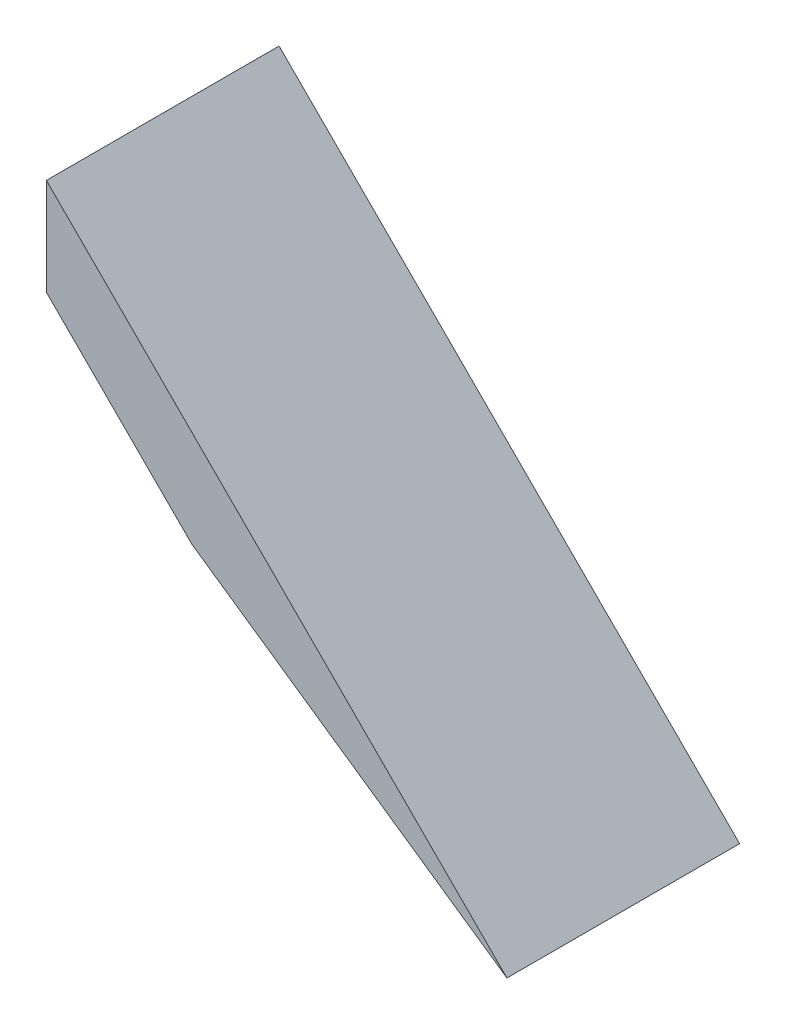
ISO-10303-21;
HEADER;
FILE_DESCRIPTION(('STEP AP214'),'2;1');
FILE_NAME('part.step','',(''),(''),'','','');
FILE_SCHEMA(('AUTOMOTIVE_DESIGN { 1 0 10303 214 1 1 1 1 }'));
ENDSEC;
DATA;
#1=APPLICATION_CONTEXT('core data for automotive mechanical design processes');
#2=APPLICATION_PROTOCOL_DEFINITION('international standard','automotive_design',2000,#1);
#3=PRODUCT_CONTEXT('',#1,'mechanical');
#4=PRODUCT('Part','Part','',(#3));
#5=PRODUCT_RELATED_PRODUCT_CATEGORY('part','',(#4));
#6=PRODUCT_DEFINITION_FORMATION('','',#4);
#7=PRODUCT_DEFINITION_CONTEXT('part definition',#1,'design');
#8=PRODUCT_DEFINITION('design','',#6,#7);
#9=PRODUCT_DEFINITION_SHAPE('','',#8);
#10=(LENGTH_UNIT() NAMED_UNIT(*) SI_UNIT(.MILLI.,.METRE.));
#11=(NAMED_UNIT(*) PLANE_ANGLE_UNIT() SI_UNIT($,.RADIAN.));
#12=(NAMED_UNIT(*) SI_UNIT($,.STERADIAN.) SOLID_ANGLE_UNIT());
#13=UNCERTAINTY_MEASURE_WITH_UNIT(LENGTH_MEASURE(1.E-05),#10,'distance_accuracy_value','');
#14=(GEOMETRIC_REPRESENTATION_CONTEXT(3) GLOBAL_UNCERTAINTY_ASSIGNED_CONTEXT((#13)) GLOBAL_UNIT_ASSIGNED_CONTEXT((#10,
#11,#12)) REPRESENTATION_CONTEXT('',''));
#15=CARTESIAN_POINT('',(0.,0.,0.));
#16=DIRECTION('',(0.,0.,1.));
#17=DIRECTION('',(1.,0.,0.));
#18=AXIS2_PLACEMENT_3D('',#15,#16,#17);
#19=CARTESIAN_POINT('',(-0.2778125,-0.03968750000001,0.));
#20=DIRECTION('',(-0.707106781186548,-0.707106781186548,0.));
#21=DIRECTION('',(0.707106781186548,-0.707106781186548,0.));
#22=AXIS2_PLACEMENT_3D('',#19,#20,#21);
#23=PLANE('',#22);
#24=DIRECTION('',(0.,0.,1.));
#25=VECTOR('',#24,1.);
#26=CARTESIAN_POINT('',(-0.7540625,0.4365625,0.));
#27=LINE('',#26,#25);
#28=CARTESIAN_POINT('',(-0.754062500000001,0.436562499999999,0.));
#29=VERTEX_POINT('',#28);
#30=CARTESIAN_POINT('',(-0.754062500000001,0.436562499999999,0.762));
#31=VERTEX_POINT('',#30);
#32=EDGE_CURVE('E20',#29,#31,#27,.T.);
#33=ORIENTED_EDGE('',*,*,#32,.F.);
#34=DIRECTION('',(0.70710678118654,-0.707106781186555,0.));
#35=VECTOR('',#34,1.);
#36=CARTESIAN_POINT('',(-0.7540625,0.4365625,0.));
#37=LINE('',#36,#35);
#38=CARTESIAN_POINT('',(-0.277812500000132,-0.0396875000002033,0.));
#39=VERTEX_POINT('',#38);
#40=EDGE_CURVE('E81',#29,#39,#37,.T.);
#41=ORIENTED_EDGE('',*,*,#40,.T.);
#42=DIRECTION('',(0.,0.,1.));
#43=VECTOR('',#42,1.);
#44=CARTESIAN_POINT('',(-0.277812500000267,-0.0396875000003946,0.));
#45=LINE('',#44,#43);
#46=CARTESIAN_POINT('',(-0.277812500000064,-0.0396875000001084,0.762));
#47=VERTEX_POINT('',#46);
#48=EDGE_CURVE('E68',#47,#39,#45,.F.);
#49=ORIENTED_EDGE('',*,*,#48,.F.);
#50=DIRECTION('',(0.70710678118654,-0.707106781186555,0.));
#51=VECTOR('',#50,1.);
#52=CARTESIAN_POINT('',(-0.7540625,0.4365625,0.762));
#53=LINE('',#52,#51);
#54=EDGE_CURVE('E55',#31,#47,#53,.T.);
#55=ORIENTED_EDGE('',*,*,#54,.F.);
#56=EDGE_LOOP('',(#33,#41,#49,#55));
#57=FACE_BOUND('',#56,.T.);
#58=ADVANCED_FACE('F17',(#57),#23,.T.);
#59=CARTESIAN_POINT('',(-0.7540625,0.4365625,0.));
#60=DIRECTION('',(-1.,0.,0.));
#61=DIRECTION('',(0.,0.,1.));
#62=AXIS2_PLACEMENT_3D('',#59,#60,#61);
#63=PLANE('',#62);
#64=DIRECTION('',(0.,0.,1.));
#65=VECTOR('',#64,1.);
#66=CARTESIAN_POINT('',(-0.7540625,0.7540625,0.));
#67=LINE('',#66,#65);
#68=CARTESIAN_POINT('',(-0.7540625,0.7540625,0.));
#69=VERTEX_POINT('',#68);
#70=CARTESIAN_POINT('',(-0.7540625,0.7540625,0.762));
#71=VERTEX_POINT('',#70);
#72=EDGE_CURVE('E83',#69,#71,#67,.T.);
#73=ORIENTED_EDGE('',*,*,#72,.F.);
#74=DIRECTION('',(0.,1.,0.));
#75=VECTOR('',#74,1.);
#76=CARTESIAN_POINT('',(-0.7540625,-0.03968750000001,0.));
#77=LINE('',#76,#75);
#78=EDGE_CURVE('E64',#69,#29,#77,.F.);
#79=ORIENTED_EDGE('',*,*,#78,.T.);
#80=ORIENTED_EDGE('',*,*,#32,.T.);
#81=DIRECTION('',(0.,1.,0.));
#82=VECTOR('',#81,1.);
#83=CARTESIAN_POINT('',(-0.7540625,-0.03968750000001,0.762));
#84=LINE('',#83,#82);
#85=EDGE_CURVE('E61',#71,#31,#84,.F.);
#86=ORIENTED_EDGE('',*,*,#85,.F.);
#87=EDGE_LOOP('',(#73,#79,#80,#86));
#88=FACE_BOUND('',#87,.T.);
#89=ADVANCED_FACE('F60',(#88),#63,.T.);
#90=CARTESIAN_POINT('',(-0.2778125,-0.03968750000001,0.762));
#91=DIRECTION('',(0.,0.,1.));
#92=DIRECTION('',(1.,0.,0.));
#93=AXIS2_PLACEMENT_3D('',#90,#91,#92);
#94=PLANE('',#93);
#95=ORIENTED_EDGE('',*,*,#85,.T.);
#96=ORIENTED_EDGE('',*,*,#54,.T.);
#97=DIRECTION('',(0.822192191643995,-0.569209978829996,0.));
#98=VECTOR('',#97,1.);
#99=CARTESIAN_POINT('',(0.7540625,-0.7540625,0.762));
#100=LINE('',#99,#98);
#101=CARTESIAN_POINT('',(0.754062500000001,-0.754062500000001,0.762));
#102=VERTEX_POINT('',#101);
#103=EDGE_CURVE('E70',#102,#47,#100,.F.);
#104=ORIENTED_EDGE('',*,*,#103,.F.);
#105=DIRECTION('',(-0.707106781186548,0.707106781186548,0.));
#106=VECTOR('',#105,1.);
#107=CARTESIAN_POINT('',(-0.7540625,0.7540625,0.762));
#108=LINE('',#107,#106);
#109=EDGE_CURVE('E74',#71,#102,#108,.F.);
#110=ORIENTED_EDGE('',*,*,#109,.F.);
#111=EDGE_LOOP('',(#95,#96,#104,#110));
#112=FACE_BOUND('',#111,.T.);
#113=ADVANCED_FACE('F72',(#112),#94,.T.);
#114=CARTESIAN_POINT('',(0.7540625,-0.7540625,0.));
#115=DIRECTION('',(-0.569209978829996,-0.822192191643995,0.));
#116=DIRECTION('',(0.822192191643995,-0.569209978829996,0.));
#117=AXIS2_PLACEMENT_3D('',#114,#115,#116);
#118=PLANE('',#117);
#119=ORIENTED_EDGE('',*,*,#48,.T.);
#120=DIRECTION('',(0.822192191643782,-0.569209978830303,0.));
#121=VECTOR('',#120,1.);
#122=CARTESIAN_POINT('',(-0.2778125,-0.03968750000001,0.));
#123=LINE('',#122,#121);
#124=CARTESIAN_POINT('',(0.754062500000001,-0.754062500000001,0.));
#125=VERTEX_POINT('',#124);
#126=EDGE_CURVE('E35',#39,#125,#123,.T.);
#127=ORIENTED_EDGE('',*,*,#126,.T.);
#128=DIRECTION('',(0.,0.,1.));
#129=VECTOR('',#128,1.);
#130=CARTESIAN_POINT('',(0.7540625,-0.7540625,0.));
#131=LINE('',#130,#129);
#132=EDGE_CURVE('E26',#102,#125,#131,.F.);
#133=ORIENTED_EDGE('',*,*,#132,.F.);
#134=ORIENTED_EDGE('',*,*,#103,.T.);
#135=EDGE_LOOP('',(#119,#127,#133,#134));
#136=FACE_BOUND('',#135,.T.);
#137=ADVANCED_FACE('F89',(#136),#118,.T.);
#138=CARTESIAN_POINT('',(-0.2778125,-0.03968750000001,0.));
#139=DIRECTION('',(0.,0.,1.));
#140=DIRECTION('',(1.,0.,0.));
#141=AXIS2_PLACEMENT_3D('',#138,#139,#140);
#142=PLANE('',#141);
#143=ORIENTED_EDGE('',*,*,#78,.F.);
#144=DIRECTION('',(-0.707106781186548,0.707106781186548,0.));
#145=VECTOR('',#144,1.);
#146=CARTESIAN_POINT('',(-0.7540625,0.7540625,0.));
#147=LINE('',#146,#145);
#148=EDGE_CURVE('E11',#125,#69,#147,.T.);
#149=ORIENTED_EDGE('',*,*,#148,.F.);
#150=ORIENTED_EDGE('',*,*,#126,.F.);
#151=ORIENTED_EDGE('',*,*,#40,.F.);
#152=EDGE_LOOP('',(#143,#149,#150,#151));
#153=FACE_BOUND('',#152,.T.);
#154=ADVANCED_FACE('F91',(#153),#142,.F.);
#155=CARTESIAN_POINT('',(-0.7540625,0.7540625,0.));
#156=DIRECTION('',(0.707106781186548,0.707106781186548,0.));
#157=DIRECTION('',(-0.707106781186548,0.707106781186548,0.));
#158=AXIS2_PLACEMENT_3D('',#155,#156,#157);
#159=PLANE('',#158);
#160=ORIENTED_EDGE('',*,*,#132,.T.);
#161=ORIENTED_EDGE('',*,*,#148,.T.);
#162=ORIENTED_EDGE('',*,*,#72,.T.);
#163=ORIENTED_EDGE('',*,*,#109,.T.);
#164=EDGE_LOOP('',(#160,#161,#162,#163));
#165=FACE_BOUND('',#164,.T.);
#166=ADVANCED_FACE('F88',(#165),#159,.T.);
#167=CLOSED_SHELL('',(#58,#89,#113,#137,#154,#166));
#168=MANIFOLD_SOLID_BREP('B1',#167);
#169=ADVANCED_BREP_SHAPE_REPRESENTATION('',(#18,#168),#14);
#170=SHAPE_DEFINITION_REPRESENTATION(#9,#169);
ENDSEC;
END-ISO-10303-21;
